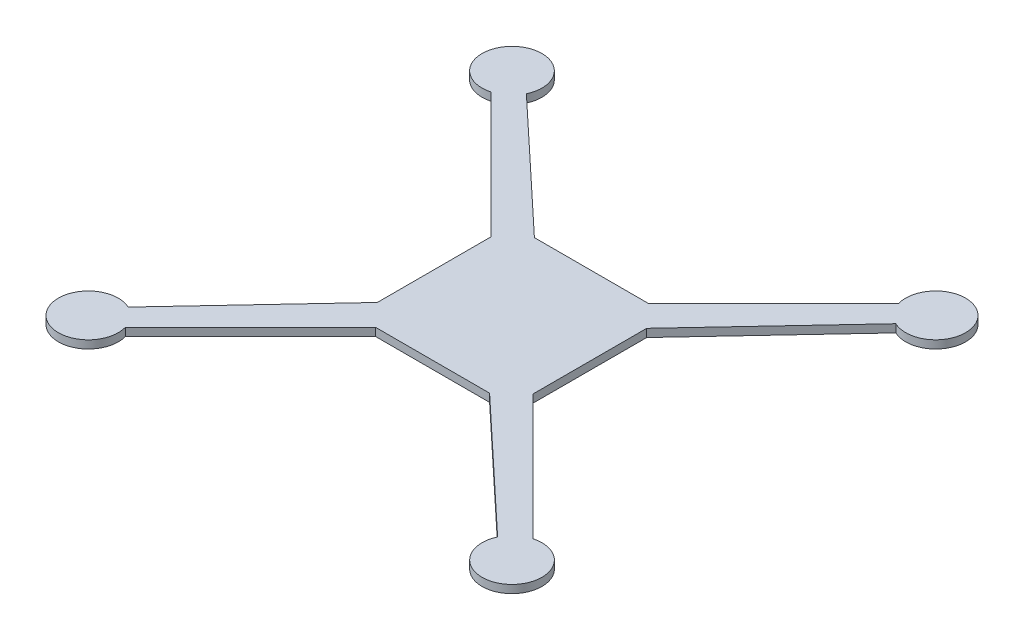
ISO-10303-21;
HEADER;
FILE_DESCRIPTION(('STEP AP214'),'2;1');
FILE_NAME('part.step','',(''),(''),'','','');
FILE_SCHEMA(('AUTOMOTIVE_DESIGN { 1 0 10303 214 1 1 1 1 }'));
ENDSEC;
DATA;
#1=APPLICATION_CONTEXT('core data for automotive mechanical design processes');
#2=APPLICATION_PROTOCOL_DEFINITION('international standard','automotive_design',2000,#1);
#3=PRODUCT_CONTEXT('',#1,'mechanical');
#4=PRODUCT('Part','Part','',(#3));
#5=PRODUCT_RELATED_PRODUCT_CATEGORY('part','',(#4));
#6=PRODUCT_DEFINITION_FORMATION('','',#4);
#7=PRODUCT_DEFINITION_CONTEXT('part definition',#1,'design');
#8=PRODUCT_DEFINITION('design','',#6,#7);
#9=PRODUCT_DEFINITION_SHAPE('','',#8);
#10=(LENGTH_UNIT() NAMED_UNIT(*) SI_UNIT(.MILLI.,.METRE.));
#11=(NAMED_UNIT(*) PLANE_ANGLE_UNIT() SI_UNIT($,.RADIAN.));
#12=(NAMED_UNIT(*) SI_UNIT($,.STERADIAN.) SOLID_ANGLE_UNIT());
#13=UNCERTAINTY_MEASURE_WITH_UNIT(LENGTH_MEASURE(1.E-05),#10,'distance_accuracy_value','');
#14=(GEOMETRIC_REPRESENTATION_CONTEXT(3) GLOBAL_UNCERTAINTY_ASSIGNED_CONTEXT((#13)) GLOBAL_UNIT_ASSIGNED_CONTEXT((#10,
#11,#12)) REPRESENTATION_CONTEXT('',''));
#15=CARTESIAN_POINT('',(0.,0.,0.));
#16=DIRECTION('',(0.,0.,1.));
#17=DIRECTION('',(1.,0.,0.));
#18=AXIS2_PLACEMENT_3D('',#15,#16,#17);
#19=CARTESIAN_POINT('',(-39.3273281893155,4.,-28.9370200530356));
#20=DIRECTION('',(0.707106781186546,0.,-0.707106781186549));
#21=DIRECTION('',(-0.707106781186549,0.,-0.707106781186546));
#22=AXIS2_PLACEMENT_3D('',#19,#20,#21);
#23=PLANE('',#22);
#24=DIRECTION('',(0.707106781186549,0.,0.707106781186546));
#25=VECTOR('',#24,1.);
#26=CARTESIAN_POINT('',(-39.3273281893155,0.,-28.9370200530356));
#27=LINE('',#26,#25);
#28=CARTESIAN_POINT('',(-102.013989285683,0.,-91.6236811494181));
#29=VERTEX_POINT('',#28);
#30=CARTESIAN_POINT('',(-39.3273281893155,0.,-28.9370200530356));
#31=VERTEX_POINT('',#30);
#32=EDGE_CURVE('E179',#29,#31,#27,.T.);
#33=ORIENTED_EDGE('',*,*,#32,.T.);
#34=DIRECTION('',(0.,-1.,0.));
#35=VECTOR('',#34,1.);
#36=CARTESIAN_POINT('',(-39.3273281893155,4.,-28.9370200530356));
#37=LINE('',#36,#35);
#38=CARTESIAN_POINT('',(-39.3273281893155,4.,-28.9370200530356));
#39=VERTEX_POINT('',#38);
#40=EDGE_CURVE('E11',#39,#31,#37,.T.);
#41=ORIENTED_EDGE('',*,*,#40,.F.);
#42=DIRECTION('',(0.707106781186549,0.,0.707106781186546));
#43=VECTOR('',#42,1.);
#44=CARTESIAN_POINT('',(-39.3273281893155,4.,-28.9370200530356));
#45=LINE('',#44,#43);
#46=CARTESIAN_POINT('',(-102.013989285683,4.,-91.6236811494181));
#47=VERTEX_POINT('',#46);
#48=EDGE_CURVE('E209',#47,#39,#45,.T.);
#49=ORIENTED_EDGE('',*,*,#48,.F.);
#50=DIRECTION('',(0.,-1.,0.));
#51=VECTOR('',#50,1.);
#52=CARTESIAN_POINT('',(-102.013989285683,4.,-91.6236811494181));
#53=LINE('',#52,#51);
#54=EDGE_CURVE('E175',#47,#29,#53,.T.);
#55=ORIENTED_EDGE('',*,*,#54,.T.);
#56=EDGE_LOOP('',(#33,#41,#49,#55));
#57=FACE_BOUND('',#56,.T.);
#58=ADVANCED_FACE('F35',(#57),#23,.F.);
#59=CARTESIAN_POINT('',(-39.3273281893155,4.,28.1076252095521));
#60=DIRECTION('',(1.,0.,0.));
#61=DIRECTION('',(0.,0.,-1.));
#62=AXIS2_PLACEMENT_3D('',#59,#60,#61);
#63=PLANE('',#62);
#64=DIRECTION('',(0.,0.,1.));
#65=VECTOR('',#64,1.);
#66=CARTESIAN_POINT('',(-39.3273281893155,0.,28.1076252095521));
#67=LINE('',#66,#65);
#68=CARTESIAN_POINT('',(-39.3273281893155,0.,28.1076252095521));
#69=VERTEX_POINT('',#68);
#70=EDGE_CURVE('E182',#31,#69,#67,.T.);
#71=ORIENTED_EDGE('',*,*,#70,.T.);
#72=DIRECTION('',(0.,-1.,0.));
#73=VECTOR('',#72,1.);
#74=CARTESIAN_POINT('',(-39.3273281893155,4.,28.1076252095521));
#75=LINE('',#74,#73);
#76=CARTESIAN_POINT('',(-39.3273281893155,4.,28.1076252095521));
#77=VERTEX_POINT('',#76);
#78=EDGE_CURVE('E43',#77,#69,#75,.T.);
#79=ORIENTED_EDGE('',*,*,#78,.F.);
#80=DIRECTION('',(0.,0.,1.));
#81=VECTOR('',#80,1.);
#82=CARTESIAN_POINT('',(-39.3273281893155,4.,28.1076252095521));
#83=LINE('',#82,#81);
#84=EDGE_CURVE('E118',#39,#77,#83,.T.);
#85=ORIENTED_EDGE('',*,*,#84,.F.);
#86=ORIENTED_EDGE('',*,*,#40,.T.);
#87=EDGE_LOOP('',(#71,#79,#85,#86));
#88=FACE_BOUND('',#87,.T.);
#89=ADVANCED_FACE('F307',(#88),#63,.F.);
#90=CARTESIAN_POINT('',(-39.3273281893155,4.,28.1076252095521));
#91=DIRECTION('',(0.729513821502789,0.,0.683966069506666));
#92=DIRECTION('',(0.683966069506666,0.,-0.729513821502789));
#93=AXIS2_PLACEMENT_3D('',#90,#91,#92);
#94=PLANE('',#93);
#95=DIRECTION('',(-0.683966069506666,0.,0.729513821502789));
#96=VECTOR('',#95,1.);
#97=CARTESIAN_POINT('',(-39.3273281893155,0.,28.1076252095521));
#98=LINE('',#97,#96);
#99=CARTESIAN_POINT('',(-99.6890436889744,0.,92.4890436889539));
#100=VERTEX_POINT('',#99);
#101=EDGE_CURVE('E184',#69,#100,#98,.T.);
#102=ORIENTED_EDGE('',*,*,#101,.T.);
#103=DIRECTION('',(0.,-1.,0.));
#104=VECTOR('',#103,1.);
#105=CARTESIAN_POINT('',(-99.6890436889744,4.,92.4890436889539));
#106=LINE('',#105,#104);
#107=CARTESIAN_POINT('',(-99.6890436889744,4.,92.4890436889539));
#108=VERTEX_POINT('',#107);
#109=EDGE_CURVE('E240',#108,#100,#106,.T.);
#110=ORIENTED_EDGE('',*,*,#109,.F.);
#111=DIRECTION('',(-0.683966069506666,0.,0.729513821502789));
#112=VECTOR('',#111,1.);
#113=CARTESIAN_POINT('',(-39.3273281893155,4.,28.1076252095521));
#114=LINE('',#113,#112);
#115=EDGE_CURVE('E248',#77,#108,#114,.T.);
#116=ORIENTED_EDGE('',*,*,#115,.F.);
#117=ORIENTED_EDGE('',*,*,#78,.T.);
#118=EDGE_LOOP('',(#102,#110,#116,#117));
#119=FACE_BOUND('',#118,.T.);
#120=ADVANCED_FACE('F246',(#119),#94,.F.);
#121=CARTESIAN_POINT('',(-106.066017177982,4.,106.066017177982));
#122=DIRECTION('',(0.,-1.,0.));
#123=DIRECTION('',(0.,0.,-1.));
#124=AXIS2_PLACEMENT_3D('',#121,#122,#123);
#125=CYLINDRICAL_SURFACE('',#124,15.0000000000642);
#126=CARTESIAN_POINT('',(-106.066017177982,0.,106.066017177982));
#127=DIRECTION('',(0.,1.,0.));
#128=DIRECTION('',(0.,0.,1.));
#129=AXIS2_PLACEMENT_3D('',#126,#127,#128);
#130=CIRCLE('',#129,15.0000000000642);
#131=CARTESIAN_POINT('',(-91.6236811494181,0.,102.013989285683));
#132=VERTEX_POINT('',#131);
#133=EDGE_CURVE('E186',#100,#132,#130,.T.);
#134=ORIENTED_EDGE('',*,*,#133,.T.);
#135=DIRECTION('',(0.,-1.,0.));
#136=VECTOR('',#135,1.);
#137=CARTESIAN_POINT('',(-91.6236811494181,4.,102.013989285683));
#138=LINE('',#137,#136);
#139=CARTESIAN_POINT('',(-91.6236811494181,4.,102.013989285683));
#140=VERTEX_POINT('',#139);
#141=EDGE_CURVE('E237',#140,#132,#138,.T.);
#142=ORIENTED_EDGE('',*,*,#141,.F.);
#143=CARTESIAN_POINT('',(-106.066017177982,4.,106.066017177982));
#144=DIRECTION('',(0.,1.,0.));
#145=DIRECTION('',(0.,0.,1.));
#146=AXIS2_PLACEMENT_3D('',#143,#144,#145);
#147=CIRCLE('',#146,15.0000000000642);
#148=EDGE_CURVE('E266',#108,#140,#147,.T.);
#149=ORIENTED_EDGE('',*,*,#148,.F.);
#150=ORIENTED_EDGE('',*,*,#109,.T.);
#151=EDGE_LOOP('',(#134,#142,#149,#150));
#152=FACE_BOUND('',#151,.T.);
#153=ADVANCED_FACE('F257',(#152),#125,.T.);
#154=CARTESIAN_POINT('',(-28.9370200530356,4.,39.3273281893156));
#155=DIRECTION('',(-0.707106781186549,0.,-0.707106781186546));
#156=DIRECTION('',(-0.707106781186546,0.,0.707106781186549));
#157=AXIS2_PLACEMENT_3D('',#154,#155,#156);
#158=PLANE('',#157);
#159=DIRECTION('',(0.707106781186546,0.,-0.707106781186549));
#160=VECTOR('',#159,1.);
#161=CARTESIAN_POINT('',(-28.9370200530356,0.,39.3273281893156));
#162=LINE('',#161,#160);
#163=CARTESIAN_POINT('',(-28.9370200530356,0.,39.3273281893156));
#164=VERTEX_POINT('',#163);
#165=EDGE_CURVE('E188',#132,#164,#162,.T.);
#166=ORIENTED_EDGE('',*,*,#165,.T.);
#167=DIRECTION('',(0.,-1.,0.));
#168=VECTOR('',#167,1.);
#169=CARTESIAN_POINT('',(-28.9370200530356,4.,39.3273281893156));
#170=LINE('',#169,#168);
#171=CARTESIAN_POINT('',(-28.9370200530356,4.,39.3273281893156));
#172=VERTEX_POINT('',#171);
#173=EDGE_CURVE('E234',#172,#164,#170,.T.);
#174=ORIENTED_EDGE('',*,*,#173,.F.);
#175=DIRECTION('',(0.707106781186546,0.,-0.707106781186549));
#176=VECTOR('',#175,1.);
#177=CARTESIAN_POINT('',(-28.9370200530356,4.,39.3273281893156));
#178=LINE('',#177,#176);
#179=EDGE_CURVE('E263',#140,#172,#178,.T.);
#180=ORIENTED_EDGE('',*,*,#179,.F.);
#181=ORIENTED_EDGE('',*,*,#141,.T.);
#182=EDGE_LOOP('',(#166,#174,#180,#181));
#183=FACE_BOUND('',#182,.T.);
#184=ADVANCED_FACE('F261',(#183),#158,.F.);
#185=CARTESIAN_POINT('',(28.1076252095521,4.,39.3273281893155));
#186=DIRECTION('',(0.,0.,-1.));
#187=DIRECTION('',(-1.,0.,0.));
#188=AXIS2_PLACEMENT_3D('',#185,#186,#187);
#189=PLANE('',#188);
#190=DIRECTION('',(1.,0.,0.));
#191=VECTOR('',#190,1.);
#192=CARTESIAN_POINT('',(28.1076252095521,0.,39.3273281893155));
#193=LINE('',#192,#191);
#194=CARTESIAN_POINT('',(28.1076252095521,0.,39.3273281893155));
#195=VERTEX_POINT('',#194);
#196=EDGE_CURVE('E190',#164,#195,#193,.T.);
#197=ORIENTED_EDGE('',*,*,#196,.T.);
#198=DIRECTION('',(0.,-1.,0.));
#199=VECTOR('',#198,1.);
#200=CARTESIAN_POINT('',(28.1076252095521,4.,39.3273281893155));
#201=LINE('',#200,#199);
#202=CARTESIAN_POINT('',(28.1076252095521,4.,39.3273281893155));
#203=VERTEX_POINT('',#202);
#204=EDGE_CURVE('E231',#203,#195,#201,.T.);
#205=ORIENTED_EDGE('',*,*,#204,.F.);
#206=DIRECTION('',(1.,0.,0.));
#207=VECTOR('',#206,1.);
#208=CARTESIAN_POINT('',(28.1076252095521,4.,39.3273281893155));
#209=LINE('',#208,#207);
#210=EDGE_CURVE('E265',#172,#203,#209,.T.);
#211=ORIENTED_EDGE('',*,*,#210,.F.);
#212=ORIENTED_EDGE('',*,*,#173,.T.);
#213=EDGE_LOOP('',(#197,#205,#211,#212));
#214=FACE_BOUND('',#213,.T.);
#215=ADVANCED_FACE('F320',(#214),#189,.F.);
#216=CARTESIAN_POINT('',(28.1076252095521,4.,39.3273281893155));
#217=DIRECTION('',(0.683966069506666,0.,-0.729513821502789));
#218=DIRECTION('',(-0.729513821502789,0.,-0.683966069506666));
#219=AXIS2_PLACEMENT_3D('',#216,#217,#218);
#220=PLANE('',#219);
#221=DIRECTION('',(0.729513821502789,0.,0.683966069506666));
#222=VECTOR('',#221,1.);
#223=CARTESIAN_POINT('',(28.1076252095521,0.,39.3273281893155));
#224=LINE('',#223,#222);
#225=CARTESIAN_POINT('',(92.4890436889539,0.,99.6890436889744));
#226=VERTEX_POINT('',#225);
#227=EDGE_CURVE('E192',#195,#226,#224,.T.);
#228=ORIENTED_EDGE('',*,*,#227,.T.);
#229=DIRECTION('',(0.,-1.,0.));
#230=VECTOR('',#229,1.);
#231=CARTESIAN_POINT('',(92.4890436889539,4.,99.6890436889744));
#232=LINE('',#231,#230);
#233=CARTESIAN_POINT('',(92.4890436889539,4.,99.6890436889744));
#234=VERTEX_POINT('',#233);
#235=EDGE_CURVE('E228',#234,#226,#232,.T.);
#236=ORIENTED_EDGE('',*,*,#235,.F.);
#237=DIRECTION('',(0.729513821502789,0.,0.683966069506666));
#238=VECTOR('',#237,1.);
#239=CARTESIAN_POINT('',(28.1076252095521,4.,39.3273281893155));
#240=LINE('',#239,#238);
#241=EDGE_CURVE('E268',#203,#234,#240,.T.);
#242=ORIENTED_EDGE('',*,*,#241,.F.);
#243=ORIENTED_EDGE('',*,*,#204,.T.);
#244=EDGE_LOOP('',(#228,#236,#242,#243));
#245=FACE_BOUND('',#244,.T.);
#246=ADVANCED_FACE('F323',(#245),#220,.F.);
#247=CARTESIAN_POINT('',(106.066017177982,4.,106.066017177982));
#248=DIRECTION('',(0.,-1.,0.));
#249=DIRECTION('',(0.,0.,-1.));
#250=AXIS2_PLACEMENT_3D('',#247,#248,#249);
#251=CYLINDRICAL_SURFACE('',#250,15.0000000000642);
#252=CARTESIAN_POINT('',(106.066017177982,0.,106.066017177982));
#253=DIRECTION('',(0.,1.,0.));
#254=DIRECTION('',(0.,0.,1.));
#255=AXIS2_PLACEMENT_3D('',#252,#253,#254);
#256=CIRCLE('',#255,15.0000000000642);
#257=CARTESIAN_POINT('',(102.013989285683,0.,91.6236811494181));
#258=VERTEX_POINT('',#257);
#259=EDGE_CURVE('E194',#226,#258,#256,.T.);
#260=ORIENTED_EDGE('',*,*,#259,.T.);
#261=DIRECTION('',(0.,-1.,0.));
#262=VECTOR('',#261,1.);
#263=CARTESIAN_POINT('',(102.013989285683,4.,91.6236811494181));
#264=LINE('',#263,#262);
#265=CARTESIAN_POINT('',(102.013989285683,4.,91.6236811494181));
#266=VERTEX_POINT('',#265);
#267=EDGE_CURVE('E225',#266,#258,#264,.T.);
#268=ORIENTED_EDGE('',*,*,#267,.F.);
#269=CARTESIAN_POINT('',(106.066017177982,4.,106.066017177982));
#270=DIRECTION('',(0.,1.,0.));
#271=DIRECTION('',(0.,0.,1.));
#272=AXIS2_PLACEMENT_3D('',#269,#270,#271);
#273=CIRCLE('',#272,15.0000000000642);
#274=EDGE_CURVE('E274',#234,#266,#273,.T.);
#275=ORIENTED_EDGE('',*,*,#274,.F.);
#276=ORIENTED_EDGE('',*,*,#235,.T.);
#277=EDGE_LOOP('',(#260,#268,#275,#276));
#278=FACE_BOUND('',#277,.T.);
#279=ADVANCED_FACE('F327',(#278),#251,.T.);
#280=CARTESIAN_POINT('',(39.3273281893156,4.,28.9370200530356));
#281=DIRECTION('',(-0.707106781186547,0.,0.707106781186548));
#282=DIRECTION('',(0.707106781186548,0.,0.707106781186547));
#283=AXIS2_PLACEMENT_3D('',#280,#281,#282);
#284=PLANE('',#283);
#285=DIRECTION('',(-0.707106781186548,0.,-0.707106781186547));
#286=VECTOR('',#285,1.);
#287=CARTESIAN_POINT('',(39.3273281893156,0.,28.9370200530356));
#288=LINE('',#287,#286);
#289=CARTESIAN_POINT('',(39.3273281893156,0.,28.9370200530356));
#290=VERTEX_POINT('',#289);
#291=EDGE_CURVE('E196',#258,#290,#288,.T.);
#292=ORIENTED_EDGE('',*,*,#291,.T.);
#293=DIRECTION('',(0.,-1.,0.));
#294=VECTOR('',#293,1.);
#295=CARTESIAN_POINT('',(39.3273281893156,4.,28.9370200530356));
#296=LINE('',#295,#294);
#297=CARTESIAN_POINT('',(39.3273281893156,4.,28.9370200530356));
#298=VERTEX_POINT('',#297);
#299=EDGE_CURVE('E222',#298,#290,#296,.T.);
#300=ORIENTED_EDGE('',*,*,#299,.F.);
#301=DIRECTION('',(-0.707106781186548,0.,-0.707106781186547));
#302=VECTOR('',#301,1.);
#303=CARTESIAN_POINT('',(39.3273281893156,4.,28.9370200530356));
#304=LINE('',#303,#302);
#305=EDGE_CURVE('E276',#266,#298,#304,.T.);
#306=ORIENTED_EDGE('',*,*,#305,.F.);
#307=ORIENTED_EDGE('',*,*,#267,.T.);
#308=EDGE_LOOP('',(#292,#300,#306,#307));
#309=FACE_BOUND('',#308,.T.);
#310=ADVANCED_FACE('F331',(#309),#284,.F.);
#311=CARTESIAN_POINT('',(39.3273281893156,4.,28.9370200530356));
#312=DIRECTION('',(-1.,0.,0.));
#313=DIRECTION('',(0.,0.,1.));
#314=AXIS2_PLACEMENT_3D('',#311,#312,#313);
#315=PLANE('',#314);
#316=DIRECTION('',(0.,0.,-1.));
#317=VECTOR('',#316,1.);
#318=CARTESIAN_POINT('',(39.3273281893156,0.,28.9370200530356));
#319=LINE('',#318,#317);
#320=CARTESIAN_POINT('',(39.3273281893155,0.,-28.1076252095522));
#321=VERTEX_POINT('',#320);
#322=EDGE_CURVE('E198',#290,#321,#319,.T.);
#323=ORIENTED_EDGE('',*,*,#322,.T.);
#324=DIRECTION('',(0.,-1.,0.));
#325=VECTOR('',#324,1.);
#326=CARTESIAN_POINT('',(39.3273281893155,4.,-28.1076252095522));
#327=LINE('',#326,#325);
#328=CARTESIAN_POINT('',(39.3273281893155,4.,-28.1076252095522));
#329=VERTEX_POINT('',#328);
#330=EDGE_CURVE('E219',#329,#321,#327,.T.);
#331=ORIENTED_EDGE('',*,*,#330,.F.);
#332=DIRECTION('',(0.,0.,-1.));
#333=VECTOR('',#332,1.);
#334=CARTESIAN_POINT('',(39.3273281893156,4.,28.9370200530356));
#335=LINE('',#334,#333);
#336=EDGE_CURVE('E278',#298,#329,#335,.T.);
#337=ORIENTED_EDGE('',*,*,#336,.F.);
#338=ORIENTED_EDGE('',*,*,#299,.T.);
#339=EDGE_LOOP('',(#323,#331,#337,#338));
#340=FACE_BOUND('',#339,.T.);
#341=ADVANCED_FACE('F335',(#340),#315,.F.);
#342=CARTESIAN_POINT('',(39.3273281893155,4.,-28.1076252095522));
#343=DIRECTION('',(-0.729513821502789,0.,-0.683966069506666));
#344=DIRECTION('',(-0.683966069506666,0.,0.729513821502789));
#345=AXIS2_PLACEMENT_3D('',#342,#343,#344);
#346=PLANE('',#345);
#347=DIRECTION('',(0.683966069506666,0.,-0.729513821502789));
#348=VECTOR('',#347,1.);
#349=CARTESIAN_POINT('',(39.3273281893155,0.,-28.1076252095522));
#350=LINE('',#349,#348);
#351=CARTESIAN_POINT('',(99.6890436889744,0.,-92.4890436889539));
#352=VERTEX_POINT('',#351);
#353=EDGE_CURVE('E200',#321,#352,#350,.T.);
#354=ORIENTED_EDGE('',*,*,#353,.T.);
#355=DIRECTION('',(0.,-1.,0.));
#356=VECTOR('',#355,1.);
#357=CARTESIAN_POINT('',(99.6890436889744,4.,-92.4890436889539));
#358=LINE('',#357,#356);
#359=CARTESIAN_POINT('',(99.6890436889744,4.,-92.4890436889539));
#360=VERTEX_POINT('',#359);
#361=EDGE_CURVE('E216',#360,#352,#358,.T.);
#362=ORIENTED_EDGE('',*,*,#361,.F.);
#363=DIRECTION('',(0.683966069506666,0.,-0.729513821502789));
#364=VECTOR('',#363,1.);
#365=CARTESIAN_POINT('',(39.3273281893155,4.,-28.1076252095522));
#366=LINE('',#365,#364);
#367=EDGE_CURVE('E280',#329,#360,#366,.T.);
#368=ORIENTED_EDGE('',*,*,#367,.F.);
#369=ORIENTED_EDGE('',*,*,#330,.T.);
#370=EDGE_LOOP('',(#354,#362,#368,#369));
#371=FACE_BOUND('',#370,.T.);
#372=ADVANCED_FACE('F339',(#371),#346,.F.);
#373=CARTESIAN_POINT('',(106.066017177982,4.,-106.066017177982));
#374=DIRECTION('',(0.,-1.,0.));
#375=DIRECTION('',(0.,0.,-1.));
#376=AXIS2_PLACEMENT_3D('',#373,#374,#375);
#377=CYLINDRICAL_SURFACE('',#376,15.0000000000642);
#378=CARTESIAN_POINT('',(106.066017177982,0.,-106.066017177982));
#379=DIRECTION('',(0.,1.,0.));
#380=DIRECTION('',(0.,0.,1.));
#381=AXIS2_PLACEMENT_3D('',#378,#379,#380);
#382=CIRCLE('',#381,15.0000000000642);
#383=CARTESIAN_POINT('',(91.6236811494182,0.,-102.013989285683));
#384=VERTEX_POINT('',#383);
#385=EDGE_CURVE('E202',#352,#384,#382,.T.);
#386=ORIENTED_EDGE('',*,*,#385,.T.);
#387=DIRECTION('',(0.,-1.,0.));
#388=VECTOR('',#387,1.);
#389=CARTESIAN_POINT('',(91.6236811494182,4.,-102.013989285683));
#390=LINE('',#389,#388);
#391=CARTESIAN_POINT('',(91.6236811494182,4.,-102.013989285683));
#392=VERTEX_POINT('',#391);
#393=EDGE_CURVE('E213',#392,#384,#390,.T.);
#394=ORIENTED_EDGE('',*,*,#393,.F.);
#395=CARTESIAN_POINT('',(106.066017177982,4.,-106.066017177982));
#396=DIRECTION('',(0.,1.,0.));
#397=DIRECTION('',(0.,0.,1.));
#398=AXIS2_PLACEMENT_3D('',#395,#396,#397);
#399=CIRCLE('',#398,15.0000000000642);
#400=EDGE_CURVE('E282',#360,#392,#399,.T.);
#401=ORIENTED_EDGE('',*,*,#400,.F.);
#402=ORIENTED_EDGE('',*,*,#361,.T.);
#403=EDGE_LOOP('',(#386,#394,#401,#402));
#404=FACE_BOUND('',#403,.T.);
#405=ADVANCED_FACE('F288',(#404),#377,.T.);
#406=CARTESIAN_POINT('',(28.9370200530356,4.,-39.3273281893155));
#407=DIRECTION('',(0.707106781186548,0.,0.707106781186547));
#408=DIRECTION('',(0.707106781186547,0.,-0.707106781186548));
#409=AXIS2_PLACEMENT_3D('',#406,#407,#408);
#410=PLANE('',#409);
#411=DIRECTION('',(-0.707106781186547,0.,0.707106781186548));
#412=VECTOR('',#411,1.);
#413=CARTESIAN_POINT('',(28.9370200530356,0.,-39.3273281893155));
#414=LINE('',#413,#412);
#415=CARTESIAN_POINT('',(28.9370200530356,0.,-39.3273281893155));
#416=VERTEX_POINT('',#415);
#417=EDGE_CURVE('E204',#384,#416,#414,.T.);
#418=ORIENTED_EDGE('',*,*,#417,.T.);
#419=DIRECTION('',(0.,-1.,0.));
#420=VECTOR('',#419,1.);
#421=CARTESIAN_POINT('',(28.9370200530356,4.,-39.3273281893155));
#422=LINE('',#421,#420);
#423=CARTESIAN_POINT('',(28.9370200530356,4.,-39.3273281893155));
#424=VERTEX_POINT('',#423);
#425=EDGE_CURVE('E170',#424,#416,#422,.T.);
#426=ORIENTED_EDGE('',*,*,#425,.F.);
#427=DIRECTION('',(-0.707106781186547,0.,0.707106781186548));
#428=VECTOR('',#427,1.);
#429=CARTESIAN_POINT('',(28.9370200530356,4.,-39.3273281893155));
#430=LINE('',#429,#428);
#431=EDGE_CURVE('E161',#392,#424,#430,.T.);
#432=ORIENTED_EDGE('',*,*,#431,.F.);
#433=ORIENTED_EDGE('',*,*,#393,.T.);
#434=EDGE_LOOP('',(#418,#426,#432,#433));
#435=FACE_BOUND('',#434,.T.);
#436=ADVANCED_FACE('F292',(#435),#410,.F.);
#437=CARTESIAN_POINT('',(28.9370200530356,4.,-39.3273281893155));
#438=DIRECTION('',(0.,0.,1.));
#439=DIRECTION('',(1.,0.,0.));
#440=AXIS2_PLACEMENT_3D('',#437,#438,#439);
#441=PLANE('',#440);
#442=DIRECTION('',(-1.,0.,0.));
#443=VECTOR('',#442,1.);
#444=CARTESIAN_POINT('',(28.9370200530356,0.,-39.3273281893155));
#445=LINE('',#444,#443);
#446=CARTESIAN_POINT('',(-28.1076252095521,0.,-39.3273281893155));
#447=VERTEX_POINT('',#446);
#448=EDGE_CURVE('E169',#416,#447,#445,.T.);
#449=ORIENTED_EDGE('',*,*,#448,.T.);
#450=DIRECTION('',(0.,-1.,0.));
#451=VECTOR('',#450,1.);
#452=CARTESIAN_POINT('',(-28.1076252095521,4.,-39.3273281893155));
#453=LINE('',#452,#451);
#454=CARTESIAN_POINT('',(-28.1076252095521,4.,-39.3273281893155));
#455=VERTEX_POINT('',#454);
#456=EDGE_CURVE('E166',#455,#447,#453,.T.);
#457=ORIENTED_EDGE('',*,*,#456,.F.);
#458=DIRECTION('',(-1.,0.,0.));
#459=VECTOR('',#458,1.);
#460=CARTESIAN_POINT('',(28.9370200530356,4.,-39.3273281893155));
#461=LINE('',#460,#459);
#462=EDGE_CURVE('E155',#424,#455,#461,.T.);
#463=ORIENTED_EDGE('',*,*,#462,.F.);
#464=ORIENTED_EDGE('',*,*,#425,.T.);
#465=EDGE_LOOP('',(#449,#457,#463,#464));
#466=FACE_BOUND('',#465,.T.);
#467=ADVANCED_FACE('F167',(#466),#441,.F.);
#468=CARTESIAN_POINT('',(-28.1076252095521,4.,-39.3273281893155));
#469=DIRECTION('',(-0.683966069506666,0.,0.729513821502789));
#470=DIRECTION('',(0.729513821502789,0.,0.683966069506666));
#471=AXIS2_PLACEMENT_3D('',#468,#469,#470);
#472=PLANE('',#471);
#473=DIRECTION('',(-0.729513821502789,0.,-0.683966069506666));
#474=VECTOR('',#473,1.);
#475=CARTESIAN_POINT('',(-28.1076252095521,0.,-39.3273281893155));
#476=LINE('',#475,#474);
#477=CARTESIAN_POINT('',(-92.4890436889539,0.,-99.6890436889744));
#478=VERTEX_POINT('',#477);
#479=EDGE_CURVE('E104',#447,#478,#476,.T.);
#480=ORIENTED_EDGE('',*,*,#479,.T.);
#481=DIRECTION('',(0.,-1.,0.));
#482=VECTOR('',#481,1.);
#483=CARTESIAN_POINT('',(-92.4890436889539,4.,-99.6890436889744));
#484=LINE('',#483,#482);
#485=CARTESIAN_POINT('',(-92.4890436889539,4.,-99.6890436889744));
#486=VERTEX_POINT('',#485);
#487=EDGE_CURVE('E171',#486,#478,#484,.T.);
#488=ORIENTED_EDGE('',*,*,#487,.F.);
#489=DIRECTION('',(-0.729513821502789,0.,-0.683966069506666));
#490=VECTOR('',#489,1.);
#491=CARTESIAN_POINT('',(-28.1076252095521,4.,-39.3273281893155));
#492=LINE('',#491,#490);
#493=EDGE_CURVE('E159',#455,#486,#492,.T.);
#494=ORIENTED_EDGE('',*,*,#493,.F.);
#495=ORIENTED_EDGE('',*,*,#456,.T.);
#496=EDGE_LOOP('',(#480,#488,#494,#495));
#497=FACE_BOUND('',#496,.T.);
#498=ADVANCED_FACE('F173',(#497),#472,.F.);
#499=CARTESIAN_POINT('',(-106.066017177982,4.,-106.066017177982));
#500=DIRECTION('',(0.,-1.,0.));
#501=DIRECTION('',(0.,0.,-1.));
#502=AXIS2_PLACEMENT_3D('',#499,#500,#501);
#503=CYLINDRICAL_SURFACE('',#502,15.0000000000642);
#504=CARTESIAN_POINT('',(-106.066017177982,0.,-106.066017177982));
#505=DIRECTION('',(0.,1.,0.));
#506=DIRECTION('',(0.,0.,1.));
#507=AXIS2_PLACEMENT_3D('',#504,#505,#506);
#508=CIRCLE('',#507,15.0000000000642);
#509=EDGE_CURVE('E110',#478,#29,#508,.T.);
#510=ORIENTED_EDGE('',*,*,#509,.T.);
#511=ORIENTED_EDGE('',*,*,#54,.F.);
#512=CARTESIAN_POINT('',(-106.066017177982,4.,-106.066017177982));
#513=DIRECTION('',(0.,1.,0.));
#514=DIRECTION('',(0.,0.,1.));
#515=AXIS2_PLACEMENT_3D('',#512,#513,#514);
#516=CIRCLE('',#515,15.0000000000642);
#517=EDGE_CURVE('E51',#486,#47,#516,.T.);
#518=ORIENTED_EDGE('',*,*,#517,.F.);
#519=ORIENTED_EDGE('',*,*,#487,.T.);
#520=EDGE_LOOP('',(#510,#511,#518,#519));
#521=FACE_BOUND('',#520,.T.);
#522=ADVANCED_FACE('F296',(#521),#503,.T.);
#523=CARTESIAN_POINT('',(-106.066017177982,4.,-106.066017177982));
#524=DIRECTION('',(0.,1.,0.));
#525=DIRECTION('',(0.,0.,1.));
#526=AXIS2_PLACEMENT_3D('',#523,#524,#525);
#527=PLANE('',#526);
#528=ORIENTED_EDGE('',*,*,#48,.T.);
#529=ORIENTED_EDGE('',*,*,#84,.T.);
#530=ORIENTED_EDGE('',*,*,#115,.T.);
#531=ORIENTED_EDGE('',*,*,#148,.T.);
#532=ORIENTED_EDGE('',*,*,#179,.T.);
#533=ORIENTED_EDGE('',*,*,#210,.T.);
#534=ORIENTED_EDGE('',*,*,#241,.T.);
#535=ORIENTED_EDGE('',*,*,#274,.T.);
#536=ORIENTED_EDGE('',*,*,#305,.T.);
#537=ORIENTED_EDGE('',*,*,#336,.T.);
#538=ORIENTED_EDGE('',*,*,#367,.T.);
#539=ORIENTED_EDGE('',*,*,#400,.T.);
#540=ORIENTED_EDGE('',*,*,#431,.T.);
#541=ORIENTED_EDGE('',*,*,#462,.T.);
#542=ORIENTED_EDGE('',*,*,#493,.T.);
#543=ORIENTED_EDGE('',*,*,#517,.T.);
#544=EDGE_LOOP('',(#528,#529,#530,#531,#532,#533,#534,#535,#536,#537,#538,#539,#540,#541,#542,#543));
#545=FACE_BOUND('',#544,.T.);
#546=ADVANCED_FACE('F157',(#545),#527,.T.);
#547=CARTESIAN_POINT('',(-106.066017177982,0.,-106.066017177982));
#548=DIRECTION('',(0.,1.,0.));
#549=DIRECTION('',(0.,0.,1.));
#550=AXIS2_PLACEMENT_3D('',#547,#548,#549);
#551=PLANE('',#550);
#552=ORIENTED_EDGE('',*,*,#32,.F.);
#553=ORIENTED_EDGE('',*,*,#509,.F.);
#554=ORIENTED_EDGE('',*,*,#479,.F.);
#555=ORIENTED_EDGE('',*,*,#448,.F.);
#556=ORIENTED_EDGE('',*,*,#417,.F.);
#557=ORIENTED_EDGE('',*,*,#385,.F.);
#558=ORIENTED_EDGE('',*,*,#353,.F.);
#559=ORIENTED_EDGE('',*,*,#322,.F.);
#560=ORIENTED_EDGE('',*,*,#291,.F.);
#561=ORIENTED_EDGE('',*,*,#259,.F.);
#562=ORIENTED_EDGE('',*,*,#227,.F.);
#563=ORIENTED_EDGE('',*,*,#196,.F.);
#564=ORIENTED_EDGE('',*,*,#165,.F.);
#565=ORIENTED_EDGE('',*,*,#133,.F.);
#566=ORIENTED_EDGE('',*,*,#101,.F.);
#567=ORIENTED_EDGE('',*,*,#70,.F.);
#568=EDGE_LOOP('',(#552,#553,#554,#555,#556,#557,#558,#559,#560,#561,#562,#563,#564,#565,#566,#567));
#569=FACE_BOUND('',#568,.T.);
#570=ADVANCED_FACE('F252',(#569),#551,.F.);
#571=CLOSED_SHELL('',(#58,#89,#120,#153,#184,#215,#246,#279,#310,#341,#372,#405,#436,#467,#498,
#522,#546,#570));
#572=MANIFOLD_SOLID_BREP('B2',#571);
#573=ADVANCED_BREP_SHAPE_REPRESENTATION('',(#18,#572),#14);
#574=SHAPE_DEFINITION_REPRESENTATION(#9,#573);
ENDSEC;
END-ISO-10303-21;
